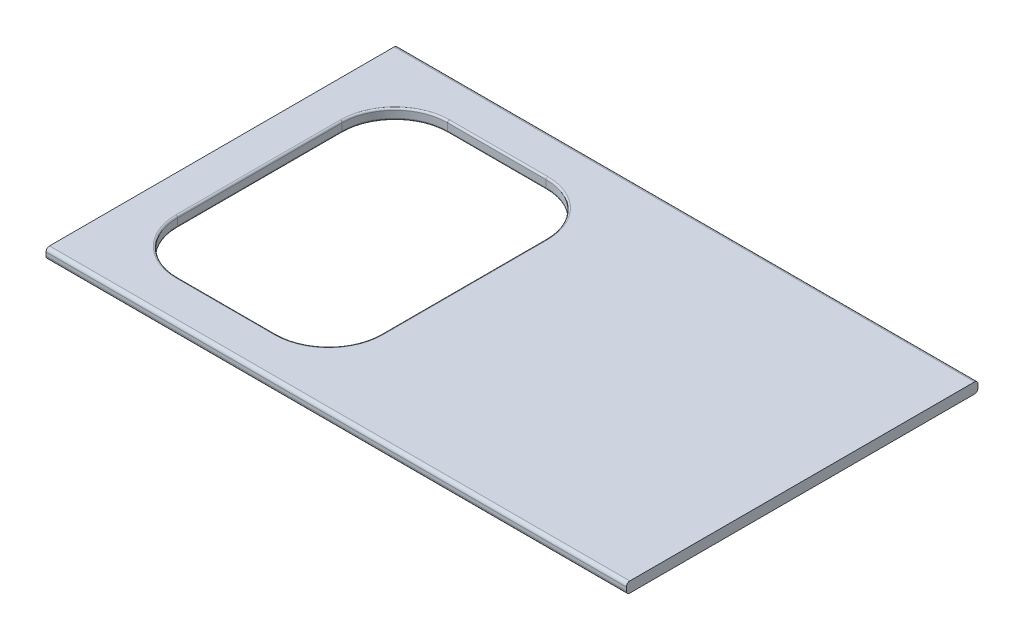
ISO-10303-21;
HEADER;
FILE_DESCRIPTION(('STEP AP214'),'2;1');
FILE_NAME('part.step','',(''),(''),'','','');
FILE_SCHEMA(('AUTOMOTIVE_DESIGN { 1 0 10303 214 1 1 1 1 }'));
ENDSEC;
DATA;
#1=APPLICATION_CONTEXT('core data for automotive mechanical design processes');
#2=APPLICATION_PROTOCOL_DEFINITION('international standard','automotive_design',2000,#1);
#3=PRODUCT_CONTEXT('',#1,'mechanical');
#4=PRODUCT('Part','Part','',(#3));
#5=PRODUCT_RELATED_PRODUCT_CATEGORY('part','',(#4));
#6=PRODUCT_DEFINITION_FORMATION('','',#4);
#7=PRODUCT_DEFINITION_CONTEXT('part definition',#1,'design');
#8=PRODUCT_DEFINITION('design','',#6,#7);
#9=PRODUCT_DEFINITION_SHAPE('','',#8);
#10=(LENGTH_UNIT() NAMED_UNIT(*) SI_UNIT(.MILLI.,.METRE.));
#11=(NAMED_UNIT(*) PLANE_ANGLE_UNIT() SI_UNIT($,.RADIAN.));
#12=(NAMED_UNIT(*) SI_UNIT($,.STERADIAN.) SOLID_ANGLE_UNIT());
#13=UNCERTAINTY_MEASURE_WITH_UNIT(LENGTH_MEASURE(1.E-05),#10,'distance_accuracy_value','');
#14=(GEOMETRIC_REPRESENTATION_CONTEXT(3) GLOBAL_UNCERTAINTY_ASSIGNED_CONTEXT((#13)) GLOBAL_UNIT_ASSIGNED_CONTEXT((#10,
#11,#12)) REPRESENTATION_CONTEXT('',''));
#15=CARTESIAN_POINT('',(0.,0.,0.));
#16=DIRECTION('',(0.,0.,1.));
#17=DIRECTION('',(1.,0.,0.));
#18=AXIS2_PLACEMENT_3D('',#15,#16,#17);
#19=CARTESIAN_POINT('',(82.5,3.,50.));
#20=DIRECTION('',(-1.,0.,0.));
#21=DIRECTION('',(0.,0.,1.));
#22=AXIS2_PLACEMENT_3D('',#19,#20,#21);
#23=PLANE('',#22);
#24=DIRECTION('',(0.,-1.,0.));
#25=VECTOR('',#24,1.);
#26=CARTESIAN_POINT('',(82.5,3.,-50.));
#27=LINE('',#26,#25);
#28=CARTESIAN_POINT('',(82.5,2.,-50.));
#29=VERTEX_POINT('',#28);
#30=CARTESIAN_POINT('',(82.5,1.,-50.));
#31=VERTEX_POINT('',#30);
#32=EDGE_CURVE('E249',#29,#31,#27,.T.);
#33=ORIENTED_EDGE('',*,*,#32,.F.);
#34=CARTESIAN_POINT('',(82.5,2.,-49.));
#35=DIRECTION('',(-1.,0.,0.));
#36=DIRECTION('',(0.,0.,1.));
#37=AXIS2_PLACEMENT_3D('',#34,#35,#36);
#38=CIRCLE('',#37,1.);
#39=CARTESIAN_POINT('',(82.5,3.,-49.));
#40=VERTEX_POINT('',#39);
#41=EDGE_CURVE('E230',#29,#40,#38,.F.);
#42=ORIENTED_EDGE('',*,*,#41,.T.);
#43=DIRECTION('',(0.,0.,-1.));
#44=VECTOR('',#43,1.);
#45=CARTESIAN_POINT('',(82.5,3.,50.));
#46=LINE('',#45,#44);
#47=CARTESIAN_POINT('',(82.5,3.,49.));
#48=VERTEX_POINT('',#47);
#49=EDGE_CURVE('E221',#48,#40,#46,.T.);
#50=ORIENTED_EDGE('',*,*,#49,.F.);
#51=CARTESIAN_POINT('',(82.5,2.,49.));
#52=DIRECTION('',(-1.,0.,0.));
#53=DIRECTION('',(0.,0.,1.));
#54=AXIS2_PLACEMENT_3D('',#51,#52,#53);
#55=CIRCLE('',#54,1.);
#56=CARTESIAN_POINT('',(82.5,2.,50.));
#57=VERTEX_POINT('',#56);
#58=EDGE_CURVE('E203',#48,#57,#55,.F.);
#59=ORIENTED_EDGE('',*,*,#58,.T.);
#60=DIRECTION('',(0.,-1.,0.));
#61=VECTOR('',#60,1.);
#62=CARTESIAN_POINT('',(82.5,3.,50.));
#63=LINE('',#62,#61);
#64=CARTESIAN_POINT('',(82.5,1.,50.));
#65=VERTEX_POINT('',#64);
#66=EDGE_CURVE('E233',#57,#65,#63,.T.);
#67=ORIENTED_EDGE('',*,*,#66,.T.);
#68=CARTESIAN_POINT('',(82.5,1.,49.));
#69=DIRECTION('',(-1.,0.,0.));
#70=DIRECTION('',(0.,0.,1.));
#71=AXIS2_PLACEMENT_3D('',#68,#69,#70);
#72=CIRCLE('',#71,1.);
#73=CARTESIAN_POINT('',(82.5,0.,49.));
#74=VERTEX_POINT('',#73);
#75=EDGE_CURVE('E214',#65,#74,#72,.F.);
#76=ORIENTED_EDGE('',*,*,#75,.T.);
#77=DIRECTION('',(0.,0.,-1.));
#78=VECTOR('',#77,1.);
#79=CARTESIAN_POINT('',(82.5,0.,50.));
#80=LINE('',#79,#78);
#81=CARTESIAN_POINT('',(82.5,0.,-49.));
#82=VERTEX_POINT('',#81);
#83=EDGE_CURVE('E236',#74,#82,#80,.T.);
#84=ORIENTED_EDGE('',*,*,#83,.T.);
#85=CARTESIAN_POINT('',(82.5,1.,-49.));
#86=DIRECTION('',(-1.,0.,0.));
#87=DIRECTION('',(0.,0.,1.));
#88=AXIS2_PLACEMENT_3D('',#85,#86,#87);
#89=CIRCLE('',#88,1.);
#90=EDGE_CURVE('E213',#82,#31,#89,.F.);
#91=ORIENTED_EDGE('',*,*,#90,.T.);
#92=EDGE_LOOP('',(#33,#42,#50,#59,#67,#76,#84,#91));
#93=FACE_BOUND('',#92,.T.);
#94=ADVANCED_FACE('F39',(#93),#23,.F.);
#95=CARTESIAN_POINT('',(-82.5,3.,-50.));
#96=DIRECTION('',(0.,0.,1.));
#97=DIRECTION('',(1.,0.,0.));
#98=AXIS2_PLACEMENT_3D('',#95,#96,#97);
#99=PLANE('',#98);
#100=DIRECTION('',(0.,-1.,0.));
#101=VECTOR('',#100,1.);
#102=CARTESIAN_POINT('',(-82.5,3.,-50.));
#103=LINE('',#102,#101);
#104=CARTESIAN_POINT('',(-82.5,2.,-50.));
#105=VERTEX_POINT('',#104);
#106=CARTESIAN_POINT('',(-82.5,1.,-50.));
#107=VERTEX_POINT('',#106);
#108=EDGE_CURVE('E246',#105,#107,#103,.T.);
#109=ORIENTED_EDGE('',*,*,#108,.F.);
#110=DIRECTION('',(-1.,0.,0.));
#111=VECTOR('',#110,1.);
#112=CARTESIAN_POINT('',(-82.5,2.,-50.));
#113=LINE('',#112,#111);
#114=EDGE_CURVE('E287',#105,#29,#113,.F.);
#115=ORIENTED_EDGE('',*,*,#114,.T.);
#116=ORIENTED_EDGE('',*,*,#32,.T.);
#117=DIRECTION('',(-1.,0.,0.));
#118=VECTOR('',#117,1.);
#119=CARTESIAN_POINT('',(-82.5,1.,-50.));
#120=LINE('',#119,#118);
#121=EDGE_CURVE('E284',#31,#107,#120,.T.);
#122=ORIENTED_EDGE('',*,*,#121,.T.);
#123=EDGE_LOOP('',(#109,#115,#116,#122));
#124=FACE_BOUND('',#123,.T.);
#125=ADVANCED_FACE('F509',(#124),#99,.F.);
#126=CARTESIAN_POINT('',(-82.5,3.,50.));
#127=DIRECTION('',(1.,0.,0.));
#128=DIRECTION('',(0.,0.,-1.));
#129=AXIS2_PLACEMENT_3D('',#126,#127,#128);
#130=PLANE('',#129);
#131=DIRECTION('',(0.,0.,1.));
#132=VECTOR('',#131,1.);
#133=CARTESIAN_POINT('',(-82.5,3.,50.));
#134=LINE('',#133,#132);
#135=CARTESIAN_POINT('',(-82.5,3.,-49.));
#136=VERTEX_POINT('',#135);
#137=CARTESIAN_POINT('',(-82.5,3.,49.));
#138=VERTEX_POINT('',#137);
#139=EDGE_CURVE('E224',#136,#138,#134,.T.);
#140=ORIENTED_EDGE('',*,*,#139,.F.);
#141=CARTESIAN_POINT('',(-82.5,2.,-49.));
#142=DIRECTION('',(1.,0.,0.));
#143=DIRECTION('',(0.,0.,-1.));
#144=AXIS2_PLACEMENT_3D('',#141,#142,#143);
#145=CIRCLE('',#144,1.);
#146=EDGE_CURVE('E282',#136,#105,#145,.F.);
#147=ORIENTED_EDGE('',*,*,#146,.T.);
#148=ORIENTED_EDGE('',*,*,#108,.T.);
#149=CARTESIAN_POINT('',(-82.5,1.,-49.));
#150=DIRECTION('',(1.,0.,0.));
#151=DIRECTION('',(0.,0.,-1.));
#152=AXIS2_PLACEMENT_3D('',#149,#150,#151);
#153=CIRCLE('',#152,1.);
#154=CARTESIAN_POINT('',(-82.5,0.,-49.));
#155=VERTEX_POINT('',#154);
#156=EDGE_CURVE('E280',#107,#155,#153,.F.);
#157=ORIENTED_EDGE('',*,*,#156,.T.);
#158=DIRECTION('',(0.,0.,1.));
#159=VECTOR('',#158,1.);
#160=CARTESIAN_POINT('',(-82.5,0.,50.));
#161=LINE('',#160,#159);
#162=CARTESIAN_POINT('',(-82.5,0.,49.));
#163=VERTEX_POINT('',#162);
#164=EDGE_CURVE('E231',#155,#163,#161,.T.);
#165=ORIENTED_EDGE('',*,*,#164,.T.);
#166=CARTESIAN_POINT('',(-82.5,1.,49.));
#167=DIRECTION('',(1.,0.,0.));
#168=DIRECTION('',(0.,0.,-1.));
#169=AXIS2_PLACEMENT_3D('',#166,#167,#168);
#170=CIRCLE('',#169,1.);
#171=CARTESIAN_POINT('',(-82.5,1.,50.));
#172=VERTEX_POINT('',#171);
#173=EDGE_CURVE('E276',#163,#172,#170,.F.);
#174=ORIENTED_EDGE('',*,*,#173,.T.);
#175=DIRECTION('',(0.,-1.,0.));
#176=VECTOR('',#175,1.);
#177=CARTESIAN_POINT('',(-82.5,3.,50.));
#178=LINE('',#177,#176);
#179=CARTESIAN_POINT('',(-82.5,2.,50.));
#180=VERTEX_POINT('',#179);
#181=EDGE_CURVE('E243',#180,#172,#178,.T.);
#182=ORIENTED_EDGE('',*,*,#181,.F.);
#183=CARTESIAN_POINT('',(-82.5,2.,49.));
#184=DIRECTION('',(1.,0.,0.));
#185=DIRECTION('',(0.,0.,-1.));
#186=AXIS2_PLACEMENT_3D('',#183,#184,#185);
#187=CIRCLE('',#186,1.);
#188=EDGE_CURVE('E278',#180,#138,#187,.F.);
#189=ORIENTED_EDGE('',*,*,#188,.T.);
#190=EDGE_LOOP('',(#140,#147,#148,#157,#165,#174,#182,#189));
#191=FACE_BOUND('',#190,.T.);
#192=ADVANCED_FACE('F514',(#191),#130,.F.);
#193=CARTESIAN_POINT('',(-82.5,3.,50.));
#194=DIRECTION('',(0.,0.,-1.));
#195=DIRECTION('',(-1.,0.,0.));
#196=AXIS2_PLACEMENT_3D('',#193,#194,#195);
#197=PLANE('',#196);
#198=ORIENTED_EDGE('',*,*,#66,.F.);
#199=DIRECTION('',(1.,0.,0.));
#200=VECTOR('',#199,1.);
#201=CARTESIAN_POINT('',(-82.5,2.,50.));
#202=LINE('',#201,#200);
#203=EDGE_CURVE('E208',#57,#180,#202,.F.);
#204=ORIENTED_EDGE('',*,*,#203,.T.);
#205=ORIENTED_EDGE('',*,*,#181,.T.);
#206=DIRECTION('',(1.,0.,0.));
#207=VECTOR('',#206,1.);
#208=CARTESIAN_POINT('',(82.5,1.,50.));
#209=LINE('',#208,#207);
#210=EDGE_CURVE('E296',#172,#65,#209,.T.);
#211=ORIENTED_EDGE('',*,*,#210,.T.);
#212=EDGE_LOOP('',(#198,#204,#205,#211));
#213=FACE_BOUND('',#212,.T.);
#214=ADVANCED_FACE('F790',(#213),#197,.F.);
#215=CARTESIAN_POINT('',(0.,3.,0.));
#216=DIRECTION('',(0.,-1.,0.));
#217=DIRECTION('',(0.,0.,-1.));
#218=AXIS2_PLACEMENT_3D('',#215,#216,#217);
#219=PLANE('',#218);
#220=DIRECTION('',(-1.,0.,0.));
#221=VECTOR('',#220,1.);
#222=CARTESIAN_POINT('',(0.,3.,38.9114531698444));
#223=LINE('',#222,#221);
#224=CARTESIAN_POINT('',(-28.7193506649499,3.,38.9114531698444));
#225=VERTEX_POINT('',#224);
#226=CARTESIAN_POINT('',(-56.6888221740228,3.,38.9114531698444));
#227=VERTEX_POINT('',#226);
#228=EDGE_CURVE('E312',#225,#227,#223,.T.);
#229=ORIENTED_EDGE('',*,*,#228,.T.);
#230=CARTESIAN_POINT('',(-56.6888221740228,3.,23.4114531698444));
#231=DIRECTION('',(0.,-1.,0.));
#232=DIRECTION('',(0.,0.,-1.));
#233=AXIS2_PLACEMENT_3D('',#230,#231,#232);
#234=CIRCLE('',#233,15.5);
#235=CARTESIAN_POINT('',(-72.1888221740228,3.,23.4114531698444));
#236=VERTEX_POINT('',#235);
#237=EDGE_CURVE('E314',#227,#236,#234,.T.);
#238=ORIENTED_EDGE('',*,*,#237,.T.);
#239=DIRECTION('',(0.,0.,-1.));
#240=VECTOR('',#239,1.);
#241=CARTESIAN_POINT('',(-72.1888221740228,3.,0.));
#242=LINE('',#241,#240);
#243=CARTESIAN_POINT('',(-72.1888221740228,3.,-23.4114531698444));
#244=VERTEX_POINT('',#243);
#245=EDGE_CURVE('E300',#236,#244,#242,.T.);
#246=ORIENTED_EDGE('',*,*,#245,.T.);
#247=CARTESIAN_POINT('',(-56.6888221740228,3.,-23.4114531698444));
#248=DIRECTION('',(0.,-1.,0.));
#249=DIRECTION('',(0.,0.,-1.));
#250=AXIS2_PLACEMENT_3D('',#247,#248,#249);
#251=CIRCLE('',#250,15.5);
#252=CARTESIAN_POINT('',(-56.6888221740228,3.,-38.9114531698444));
#253=VERTEX_POINT('',#252);
#254=EDGE_CURVE('E302',#244,#253,#251,.T.);
#255=ORIENTED_EDGE('',*,*,#254,.T.);
#256=DIRECTION('',(1.,0.,0.));
#257=VECTOR('',#256,1.);
#258=CARTESIAN_POINT('',(0.,3.,-38.9114531698444));
#259=LINE('',#258,#257);
#260=CARTESIAN_POINT('',(-28.7193506649499,3.,-38.9114531698444));
#261=VERTEX_POINT('',#260);
#262=EDGE_CURVE('E304',#253,#261,#259,.T.);
#263=ORIENTED_EDGE('',*,*,#262,.T.);
#264=CARTESIAN_POINT('',(-28.7193506649499,3.,-23.4114531698444));
#265=DIRECTION('',(0.,-1.,0.));
#266=DIRECTION('',(0.,0.,-1.));
#267=AXIS2_PLACEMENT_3D('',#264,#265,#266);
#268=CIRCLE('',#267,15.5);
#269=CARTESIAN_POINT('',(-13.2193506649499,3.,-23.4114531698444));
#270=VERTEX_POINT('',#269);
#271=EDGE_CURVE('E306',#261,#270,#268,.T.);
#272=ORIENTED_EDGE('',*,*,#271,.T.);
#273=DIRECTION('',(0.,0.,1.));
#274=VECTOR('',#273,1.);
#275=CARTESIAN_POINT('',(-13.2193506649499,3.,0.));
#276=LINE('',#275,#274);
#277=CARTESIAN_POINT('',(-13.2193506649499,3.,23.4114531698444));
#278=VERTEX_POINT('',#277);
#279=EDGE_CURVE('E308',#270,#278,#276,.T.);
#280=ORIENTED_EDGE('',*,*,#279,.T.);
#281=CARTESIAN_POINT('',(-28.7193506649499,3.,23.4114531698444));
#282=DIRECTION('',(0.,-1.,0.));
#283=DIRECTION('',(0.,0.,-1.));
#284=AXIS2_PLACEMENT_3D('',#281,#282,#283);
#285=CIRCLE('',#284,15.5);
#286=EDGE_CURVE('E310',#278,#225,#285,.T.);
#287=ORIENTED_EDGE('',*,*,#286,.T.);
#288=EDGE_LOOP('',(#229,#238,#246,#255,#263,#272,#280,#287));
#289=FACE_BOUND('',#288,.T.);
#290=ORIENTED_EDGE('',*,*,#49,.T.);
#291=DIRECTION('',(-1.,0.,0.));
#292=VECTOR('',#291,1.);
#293=CARTESIAN_POINT('',(0.,3.,-49.));
#294=LINE('',#293,#292);
#295=EDGE_CURVE('E225',#40,#136,#294,.T.);
#296=ORIENTED_EDGE('',*,*,#295,.T.);
#297=ORIENTED_EDGE('',*,*,#139,.T.);
#298=DIRECTION('',(1.,0.,0.));
#299=VECTOR('',#298,1.);
#300=CARTESIAN_POINT('',(0.,3.,49.));
#301=LINE('',#300,#299);
#302=EDGE_CURVE('E207',#138,#48,#301,.T.);
#303=ORIENTED_EDGE('',*,*,#302,.T.);
#304=EDGE_LOOP('',(#290,#296,#297,#303));
#305=FACE_BOUND('',#304,.T.);
#306=ADVANCED_FACE('F219',(#289,#305),#219,.F.);
#307=CARTESIAN_POINT('',(0.,0.,0.));
#308=DIRECTION('',(0.,-1.,0.));
#309=DIRECTION('',(0.,0.,-1.));
#310=AXIS2_PLACEMENT_3D('',#307,#308,#309);
#311=PLANE('',#310);
#312=DIRECTION('',(0.,0.,-1.));
#313=VECTOR('',#312,1.);
#314=CARTESIAN_POINT('',(-72.1888221740228,0.,23.4114531698445));
#315=LINE('',#314,#313);
#316=CARTESIAN_POINT('',(-72.1888221740228,0.,-23.4114531698444));
#317=VERTEX_POINT('',#316);
#318=CARTESIAN_POINT('',(-72.1888221740228,0.,23.4114531698444));
#319=VERTEX_POINT('',#318);
#320=EDGE_CURVE('E347',#317,#319,#315,.F.);
#321=ORIENTED_EDGE('',*,*,#320,.T.);
#322=CARTESIAN_POINT('',(-56.6888221740228,0.,23.4114531698444));
#323=DIRECTION('',(0.,-1.,0.));
#324=DIRECTION('',(0.,0.,-1.));
#325=AXIS2_PLACEMENT_3D('',#322,#323,#324);
#326=CIRCLE('',#325,15.5);
#327=CARTESIAN_POINT('',(-56.6888221740228,0.,38.9114531698444));
#328=VERTEX_POINT('',#327);
#329=EDGE_CURVE('E360',#319,#328,#326,.F.);
#330=ORIENTED_EDGE('',*,*,#329,.T.);
#331=DIRECTION('',(-1.,0.,0.));
#332=VECTOR('',#331,1.);
#333=CARTESIAN_POINT('',(-28.7193506649499,0.,38.9114531698444));
#334=LINE('',#333,#332);
#335=CARTESIAN_POINT('',(-28.7193506649499,0.,38.9114531698444));
#336=VERTEX_POINT('',#335);
#337=EDGE_CURVE('E63',#328,#336,#334,.F.);
#338=ORIENTED_EDGE('',*,*,#337,.T.);
#339=CARTESIAN_POINT('',(-28.7193506649499,0.,23.4114531698444));
#340=DIRECTION('',(0.,-1.,0.));
#341=DIRECTION('',(0.,0.,-1.));
#342=AXIS2_PLACEMENT_3D('',#339,#340,#341);
#343=CIRCLE('',#342,15.5);
#344=CARTESIAN_POINT('',(-13.2193506649499,0.,23.4114531698444));
#345=VERTEX_POINT('',#344);
#346=EDGE_CURVE('E357',#336,#345,#343,.F.);
#347=ORIENTED_EDGE('',*,*,#346,.T.);
#348=DIRECTION('',(0.,0.,1.));
#349=VECTOR('',#348,1.);
#350=CARTESIAN_POINT('',(-13.2193506649499,0.,-23.4114531698444));
#351=LINE('',#350,#349);
#352=CARTESIAN_POINT('',(-13.2193506649499,0.,-23.4114531698444));
#353=VERTEX_POINT('',#352);
#354=EDGE_CURVE('E355',#345,#353,#351,.F.);
#355=ORIENTED_EDGE('',*,*,#354,.T.);
#356=CARTESIAN_POINT('',(-28.7193506649499,0.,-23.4114531698444));
#357=DIRECTION('',(0.,-1.,0.));
#358=DIRECTION('',(0.,0.,-1.));
#359=AXIS2_PLACEMENT_3D('',#356,#357,#358);
#360=CIRCLE('',#359,15.5);
#361=CARTESIAN_POINT('',(-28.7193506649499,0.,-38.9114531698444));
#362=VERTEX_POINT('',#361);
#363=EDGE_CURVE('E353',#353,#362,#360,.F.);
#364=ORIENTED_EDGE('',*,*,#363,.T.);
#365=DIRECTION('',(1.,0.,0.));
#366=VECTOR('',#365,1.);
#367=CARTESIAN_POINT('',(-56.6888221740228,0.,-38.9114531698444));
#368=LINE('',#367,#366);
#369=CARTESIAN_POINT('',(-56.6888221740228,0.,-38.9114531698444));
#370=VERTEX_POINT('',#369);
#371=EDGE_CURVE('E351',#362,#370,#368,.F.);
#372=ORIENTED_EDGE('',*,*,#371,.T.);
#373=CARTESIAN_POINT('',(-56.6888221740228,0.,-23.4114531698444));
#374=DIRECTION('',(0.,-1.,0.));
#375=DIRECTION('',(0.,0.,-1.));
#376=AXIS2_PLACEMENT_3D('',#373,#374,#375);
#377=CIRCLE('',#376,15.5);
#378=EDGE_CURVE('E349',#370,#317,#377,.F.);
#379=ORIENTED_EDGE('',*,*,#378,.T.);
#380=EDGE_LOOP('',(#321,#330,#338,#347,#355,#364,#372,#379));
#381=FACE_BOUND('',#380,.T.);
#382=ORIENTED_EDGE('',*,*,#164,.F.);
#383=DIRECTION('',(-1.,0.,0.));
#384=VECTOR('',#383,1.);
#385=CARTESIAN_POINT('',(82.5,0.,-49.));
#386=LINE('',#385,#384);
#387=EDGE_CURVE('E294',#155,#82,#386,.F.);
#388=ORIENTED_EDGE('',*,*,#387,.T.);
#389=ORIENTED_EDGE('',*,*,#83,.F.);
#390=DIRECTION('',(1.,0.,0.));
#391=VECTOR('',#390,1.);
#392=CARTESIAN_POINT('',(-82.5,0.,49.));
#393=LINE('',#392,#391);
#394=EDGE_CURVE('E292',#74,#163,#393,.F.);
#395=ORIENTED_EDGE('',*,*,#394,.T.);
#396=EDGE_LOOP('',(#382,#388,#389,#395));
#397=FACE_BOUND('',#396,.T.);
#398=ADVANCED_FACE('F498',(#381,#397),#311,.T.);
#399=CARTESIAN_POINT('',(-13.7193506649499,3.,38.4114531698444));
#400=DIRECTION('',(1.,0.,0.));
#401=DIRECTION('',(0.,0.,-1.));
#402=AXIS2_PLACEMENT_3D('',#399,#400,#401);
#403=PLANE('',#402);
#404=DIRECTION('',(0.,-1.,0.));
#405=VECTOR('',#404,1.);
#406=CARTESIAN_POINT('',(-13.7193506649499,3.,23.4114531698444));
#407=LINE('',#406,#405);
#408=CARTESIAN_POINT('',(-13.7193506649499,0.5,23.4114531698444));
#409=VERTEX_POINT('',#408);
#410=CARTESIAN_POINT('',(-13.7193506649499,2.5,23.4114531698444));
#411=VERTEX_POINT('',#410);
#412=EDGE_CURVE('E270',#409,#411,#407,.F.);
#413=ORIENTED_EDGE('',*,*,#412,.T.);
#414=DIRECTION('',(0.,0.,1.));
#415=VECTOR('',#414,1.);
#416=CARTESIAN_POINT('',(-13.7193506649499,2.5,38.4114531698444));
#417=LINE('',#416,#415);
#418=CARTESIAN_POINT('',(-13.7193506649499,2.5,-23.4114531698444));
#419=VERTEX_POINT('',#418);
#420=EDGE_CURVE('E333',#411,#419,#417,.F.);
#421=ORIENTED_EDGE('',*,*,#420,.T.);
#422=DIRECTION('',(0.,-1.,0.));
#423=VECTOR('',#422,1.);
#424=CARTESIAN_POINT('',(-13.7193506649499,0.,-23.4114531698444));
#425=LINE('',#424,#423);
#426=CARTESIAN_POINT('',(-13.7193506649499,0.5,-23.4114531698444));
#427=VERTEX_POINT('',#426);
#428=EDGE_CURVE('E226',#419,#427,#425,.T.);
#429=ORIENTED_EDGE('',*,*,#428,.T.);
#430=DIRECTION('',(0.,0.,1.));
#431=VECTOR('',#430,1.);
#432=CARTESIAN_POINT('',(-13.7193506649499,0.5,23.4114531698445));
#433=LINE('',#432,#431);
#434=EDGE_CURVE('E331',#427,#409,#433,.T.);
#435=ORIENTED_EDGE('',*,*,#434,.T.);
#436=EDGE_LOOP('',(#413,#421,#429,#435));
#437=FACE_BOUND('',#436,.T.);
#438=ADVANCED_FACE('F420',(#437),#403,.F.);
#439=CARTESIAN_POINT('',(-71.6888221740228,3.,-38.4114531698444));
#440=DIRECTION('',(0.,0.,-1.));
#441=DIRECTION('',(-1.,0.,0.));
#442=AXIS2_PLACEMENT_3D('',#439,#440,#441);
#443=PLANE('',#442);
#444=DIRECTION('',(0.,-1.,0.));
#445=VECTOR('',#444,1.);
#446=CARTESIAN_POINT('',(-28.7193506649499,3.,-38.4114531698444));
#447=LINE('',#446,#445);
#448=CARTESIAN_POINT('',(-28.7193506649499,0.5,-38.4114531698444));
#449=VERTEX_POINT('',#448);
#450=CARTESIAN_POINT('',(-28.7193506649499,2.5,-38.4114531698444));
#451=VERTEX_POINT('',#450);
#452=EDGE_CURVE('E252',#449,#451,#447,.F.);
#453=ORIENTED_EDGE('',*,*,#452,.T.);
#454=DIRECTION('',(1.,0.,0.));
#455=VECTOR('',#454,1.);
#456=CARTESIAN_POINT('',(-71.6888221740228,2.5,-38.4114531698444));
#457=LINE('',#456,#455);
#458=CARTESIAN_POINT('',(-56.6888221740228,2.5,-38.4114531698444));
#459=VERTEX_POINT('',#458);
#460=EDGE_CURVE('E341',#451,#459,#457,.F.);
#461=ORIENTED_EDGE('',*,*,#460,.T.);
#462=DIRECTION('',(0.,-1.,0.));
#463=VECTOR('',#462,1.);
#464=CARTESIAN_POINT('',(-56.6888221740228,0.,-38.4114531698444));
#465=LINE('',#464,#463);
#466=CARTESIAN_POINT('',(-56.6888221740228,0.5,-38.4114531698444));
#467=VERTEX_POINT('',#466);
#468=EDGE_CURVE('E255',#459,#467,#465,.T.);
#469=ORIENTED_EDGE('',*,*,#468,.T.);
#470=DIRECTION('',(1.,0.,0.));
#471=VECTOR('',#470,1.);
#472=CARTESIAN_POINT('',(-28.7193506649499,0.5,-38.4114531698444));
#473=LINE('',#472,#471);
#474=EDGE_CURVE('E339',#467,#449,#473,.T.);
#475=ORIENTED_EDGE('',*,*,#474,.T.);
#476=EDGE_LOOP('',(#453,#461,#469,#475));
#477=FACE_BOUND('',#476,.T.);
#478=ADVANCED_FACE('F443',(#477),#443,.F.);
#479=CARTESIAN_POINT('',(-71.6888221740228,3.,38.4114531698444));
#480=DIRECTION('',(-1.,0.,0.));
#481=DIRECTION('',(0.,0.,1.));
#482=AXIS2_PLACEMENT_3D('',#479,#480,#481);
#483=PLANE('',#482);
#484=DIRECTION('',(0.,-1.,0.));
#485=VECTOR('',#484,1.);
#486=CARTESIAN_POINT('',(-71.6888221740228,3.,-23.4114531698444));
#487=LINE('',#486,#485);
#488=CARTESIAN_POINT('',(-71.6888221740228,0.5,-23.4114531698444));
#489=VERTEX_POINT('',#488);
#490=CARTESIAN_POINT('',(-71.6888221740228,2.5,-23.4114531698444));
#491=VERTEX_POINT('',#490);
#492=EDGE_CURVE('E261',#489,#491,#487,.F.);
#493=ORIENTED_EDGE('',*,*,#492,.T.);
#494=DIRECTION('',(0.,0.,-1.));
#495=VECTOR('',#494,1.);
#496=CARTESIAN_POINT('',(-71.6888221740228,2.5,38.4114531698444));
#497=LINE('',#496,#495);
#498=CARTESIAN_POINT('',(-71.6888221740228,2.5,23.4114531698444));
#499=VERTEX_POINT('',#498);
#500=EDGE_CURVE('E11',#491,#499,#497,.F.);
#501=ORIENTED_EDGE('',*,*,#500,.T.);
#502=DIRECTION('',(0.,-1.,0.));
#503=VECTOR('',#502,1.);
#504=CARTESIAN_POINT('',(-71.6888221740228,0.,23.4114531698444));
#505=LINE('',#504,#503);
#506=CARTESIAN_POINT('',(-71.6888221740228,0.5,23.4114531698444));
#507=VERTEX_POINT('',#506);
#508=EDGE_CURVE('E258',#499,#507,#505,.T.);
#509=ORIENTED_EDGE('',*,*,#508,.T.);
#510=DIRECTION('',(0.,0.,-1.));
#511=VECTOR('',#510,1.);
#512=CARTESIAN_POINT('',(-71.6888221740228,0.5,-23.4114531698444));
#513=LINE('',#512,#511);
#514=EDGE_CURVE('E48',#507,#489,#513,.T.);
#515=ORIENTED_EDGE('',*,*,#514,.T.);
#516=EDGE_LOOP('',(#493,#501,#509,#515));
#517=FACE_BOUND('',#516,.T.);
#518=ADVANCED_FACE('F464',(#517),#483,.F.);
#519=CARTESIAN_POINT('',(-71.6888221740228,3.,38.4114531698444));
#520=DIRECTION('',(0.,0.,1.));
#521=DIRECTION('',(1.,0.,0.));
#522=AXIS2_PLACEMENT_3D('',#519,#520,#521);
#523=PLANE('',#522);
#524=DIRECTION('',(0.,-1.,0.));
#525=VECTOR('',#524,1.);
#526=CARTESIAN_POINT('',(-56.6888221740228,3.,38.4114531698444));
#527=LINE('',#526,#525);
#528=CARTESIAN_POINT('',(-56.6888221740228,0.5,38.4114531698444));
#529=VERTEX_POINT('',#528);
#530=CARTESIAN_POINT('',(-56.6888221740228,2.5,38.4114531698444));
#531=VERTEX_POINT('',#530);
#532=EDGE_CURVE('E267',#529,#531,#527,.F.);
#533=ORIENTED_EDGE('',*,*,#532,.T.);
#534=DIRECTION('',(-1.,0.,0.));
#535=VECTOR('',#534,1.);
#536=CARTESIAN_POINT('',(-71.6888221740228,2.5,38.4114531698444));
#537=LINE('',#536,#535);
#538=CARTESIAN_POINT('',(-28.7193506649499,2.5,38.4114531698444));
#539=VERTEX_POINT('',#538);
#540=EDGE_CURVE('E325',#531,#539,#537,.F.);
#541=ORIENTED_EDGE('',*,*,#540,.T.);
#542=DIRECTION('',(0.,-1.,0.));
#543=VECTOR('',#542,1.);
#544=CARTESIAN_POINT('',(-28.7193506649499,0.,38.4114531698444));
#545=LINE('',#544,#543);
#546=CARTESIAN_POINT('',(-28.7193506649499,0.5,38.4114531698444));
#547=VERTEX_POINT('',#546);
#548=EDGE_CURVE('E264',#539,#547,#545,.T.);
#549=ORIENTED_EDGE('',*,*,#548,.T.);
#550=DIRECTION('',(-1.,0.,0.));
#551=VECTOR('',#550,1.);
#552=CARTESIAN_POINT('',(-56.6888221740228,0.5,38.4114531698444));
#553=LINE('',#552,#551);
#554=EDGE_CURVE('E323',#547,#529,#553,.T.);
#555=ORIENTED_EDGE('',*,*,#554,.T.);
#556=EDGE_LOOP('',(#533,#541,#549,#555));
#557=FACE_BOUND('',#556,.T.);
#558=ADVANCED_FACE('F477',(#557),#523,.F.);
#559=CARTESIAN_POINT('',(-56.6888221740228,3.,-23.4114531698444));
#560=DIRECTION('',(0.,1.,0.));
#561=DIRECTION('',(0.,0.,1.));
#562=AXIS2_PLACEMENT_3D('',#559,#560,#561);
#563=CYLINDRICAL_SURFACE('',#562,15.);
#564=ORIENTED_EDGE('',*,*,#468,.F.);
#565=CARTESIAN_POINT('',(-56.6888221740228,2.5,-23.4114531698444));
#566=DIRECTION('',(0.,-1.,0.));
#567=DIRECTION('',(0.,0.,-1.));
#568=AXIS2_PLACEMENT_3D('',#565,#566,#567);
#569=CIRCLE('',#568,15.);
#570=EDGE_CURVE('E345',#459,#491,#569,.F.);
#571=ORIENTED_EDGE('',*,*,#570,.T.);
#572=ORIENTED_EDGE('',*,*,#492,.F.);
#573=CARTESIAN_POINT('',(-56.6888221740228,0.5,-23.4114531698444));
#574=DIRECTION('',(0.,-1.,0.));
#575=DIRECTION('',(0.,0.,-1.));
#576=AXIS2_PLACEMENT_3D('',#573,#574,#575);
#577=CIRCLE('',#576,15.);
#578=EDGE_CURVE('E343',#489,#467,#577,.T.);
#579=ORIENTED_EDGE('',*,*,#578,.T.);
#580=EDGE_LOOP('',(#564,#571,#572,#579));
#581=FACE_BOUND('',#580,.T.);
#582=ADVANCED_FACE('F447',(#581),#563,.F.);
#583=CARTESIAN_POINT('',(-56.6888221740228,3.,23.4114531698444));
#584=DIRECTION('',(0.,1.,0.));
#585=DIRECTION('',(0.,0.,1.));
#586=AXIS2_PLACEMENT_3D('',#583,#584,#585);
#587=CYLINDRICAL_SURFACE('',#586,15.);
#588=ORIENTED_EDGE('',*,*,#508,.F.);
#589=CARTESIAN_POINT('',(-56.6888221740228,2.5,23.4114531698444));
#590=DIRECTION('',(0.,-1.,0.));
#591=DIRECTION('',(0.,0.,-1.));
#592=AXIS2_PLACEMENT_3D('',#589,#590,#591);
#593=CIRCLE('',#592,15.);
#594=EDGE_CURVE('E320',#499,#531,#593,.F.);
#595=ORIENTED_EDGE('',*,*,#594,.T.);
#596=ORIENTED_EDGE('',*,*,#532,.F.);
#597=CARTESIAN_POINT('',(-56.6888221740228,0.5,23.4114531698444));
#598=DIRECTION('',(0.,-1.,0.));
#599=DIRECTION('',(0.,0.,-1.));
#600=AXIS2_PLACEMENT_3D('',#597,#598,#599);
#601=CIRCLE('',#600,15.);
#602=EDGE_CURVE('E317',#529,#507,#601,.T.);
#603=ORIENTED_EDGE('',*,*,#602,.T.);
#604=EDGE_LOOP('',(#588,#595,#596,#603));
#605=FACE_BOUND('',#604,.T.);
#606=ADVANCED_FACE('F467',(#605),#587,.F.);
#607=CARTESIAN_POINT('',(-28.7193506649499,3.,-23.4114531698444));
#608=DIRECTION('',(0.,1.,0.));
#609=DIRECTION('',(0.,0.,1.));
#610=AXIS2_PLACEMENT_3D('',#607,#608,#609);
#611=CYLINDRICAL_SURFACE('',#610,15.);
#612=ORIENTED_EDGE('',*,*,#428,.F.);
#613=CARTESIAN_POINT('',(-28.7193506649499,2.5,-23.4114531698444));
#614=DIRECTION('',(0.,-1.,0.));
#615=DIRECTION('',(0.,0.,-1.));
#616=AXIS2_PLACEMENT_3D('',#613,#614,#615);
#617=CIRCLE('',#616,15.);
#618=EDGE_CURVE('E337',#419,#451,#617,.F.);
#619=ORIENTED_EDGE('',*,*,#618,.T.);
#620=ORIENTED_EDGE('',*,*,#452,.F.);
#621=CARTESIAN_POINT('',(-28.7193506649499,0.5,-23.4114531698444));
#622=DIRECTION('',(0.,-1.,0.));
#623=DIRECTION('',(0.,0.,-1.));
#624=AXIS2_PLACEMENT_3D('',#621,#622,#623);
#625=CIRCLE('',#624,15.);
#626=EDGE_CURVE('E335',#449,#427,#625,.T.);
#627=ORIENTED_EDGE('',*,*,#626,.T.);
#628=EDGE_LOOP('',(#612,#619,#620,#627));
#629=FACE_BOUND('',#628,.T.);
#630=ADVANCED_FACE('F417',(#629),#611,.F.);
#631=CARTESIAN_POINT('',(-28.7193506649499,3.,23.4114531698444));
#632=DIRECTION('',(0.,1.,0.));
#633=DIRECTION('',(0.,0.,1.));
#634=AXIS2_PLACEMENT_3D('',#631,#632,#633);
#635=CYLINDRICAL_SURFACE('',#634,15.);
#636=ORIENTED_EDGE('',*,*,#548,.F.);
#637=CARTESIAN_POINT('',(-28.7193506649499,2.5,23.4114531698444));
#638=DIRECTION('',(0.,-1.,0.));
#639=DIRECTION('',(0.,0.,-1.));
#640=AXIS2_PLACEMENT_3D('',#637,#638,#639);
#641=CIRCLE('',#640,15.);
#642=EDGE_CURVE('E329',#539,#411,#641,.F.);
#643=ORIENTED_EDGE('',*,*,#642,.T.);
#644=ORIENTED_EDGE('',*,*,#412,.F.);
#645=CARTESIAN_POINT('',(-28.7193506649499,0.5,23.4114531698444));
#646=DIRECTION('',(0.,-1.,0.));
#647=DIRECTION('',(0.,0.,-1.));
#648=AXIS2_PLACEMENT_3D('',#645,#646,#647);
#649=CIRCLE('',#648,15.);
#650=EDGE_CURVE('E327',#409,#547,#649,.T.);
#651=ORIENTED_EDGE('',*,*,#650,.T.);
#652=EDGE_LOOP('',(#636,#643,#644,#651));
#653=FACE_BOUND('',#652,.T.);
#654=ADVANCED_FACE('F480',(#653),#635,.F.);
#655=CARTESIAN_POINT('',(0.,2.,-49.));
#656=DIRECTION('',(-1.,0.,0.));
#657=DIRECTION('',(0.,0.,1.));
#658=AXIS2_PLACEMENT_3D('',#655,#656,#657);
#659=CYLINDRICAL_SURFACE('',#658,1.);
#660=ORIENTED_EDGE('',*,*,#41,.F.);
#661=ORIENTED_EDGE('',*,*,#114,.F.);
#662=ORIENTED_EDGE('',*,*,#146,.F.);
#663=ORIENTED_EDGE('',*,*,#295,.F.);
#664=EDGE_LOOP('',(#660,#661,#662,#663));
#665=FACE_BOUND('',#664,.T.);
#666=ADVANCED_FACE('F527',(#665),#659,.T.);
#667=CARTESIAN_POINT('',(-82.5,1.,-49.));
#668=DIRECTION('',(1.,0.,0.));
#669=DIRECTION('',(0.,0.,-1.));
#670=AXIS2_PLACEMENT_3D('',#667,#668,#669);
#671=CYLINDRICAL_SURFACE('',#670,1.);
#672=ORIENTED_EDGE('',*,*,#90,.F.);
#673=ORIENTED_EDGE('',*,*,#387,.F.);
#674=ORIENTED_EDGE('',*,*,#156,.F.);
#675=ORIENTED_EDGE('',*,*,#121,.F.);
#676=EDGE_LOOP('',(#672,#673,#674,#675));
#677=FACE_BOUND('',#676,.T.);
#678=ADVANCED_FACE('F530',(#677),#671,.T.);
#679=CARTESIAN_POINT('',(0.,2.,49.));
#680=DIRECTION('',(1.,0.,0.));
#681=DIRECTION('',(0.,0.,-1.));
#682=AXIS2_PLACEMENT_3D('',#679,#680,#681);
#683=CYLINDRICAL_SURFACE('',#682,1.);
#684=ORIENTED_EDGE('',*,*,#188,.F.);
#685=ORIENTED_EDGE('',*,*,#203,.F.);
#686=ORIENTED_EDGE('',*,*,#58,.F.);
#687=ORIENTED_EDGE('',*,*,#302,.F.);
#688=EDGE_LOOP('',(#684,#685,#686,#687));
#689=FACE_BOUND('',#688,.T.);
#690=ADVANCED_FACE('F206',(#689),#683,.T.);
#691=CARTESIAN_POINT('',(-82.5,1.,49.));
#692=DIRECTION('',(-1.,0.,0.));
#693=DIRECTION('',(0.,0.,1.));
#694=AXIS2_PLACEMENT_3D('',#691,#692,#693);
#695=CYLINDRICAL_SURFACE('',#694,1.);
#696=ORIENTED_EDGE('',*,*,#173,.F.);
#697=ORIENTED_EDGE('',*,*,#394,.F.);
#698=ORIENTED_EDGE('',*,*,#75,.F.);
#699=ORIENTED_EDGE('',*,*,#210,.F.);
#700=EDGE_LOOP('',(#696,#697,#698,#699));
#701=FACE_BOUND('',#700,.T.);
#702=ADVANCED_FACE('F537',(#701),#695,.T.);
#703=CARTESIAN_POINT('',(-28.7193506649499,2.5,-23.4114531698444));
#704=DIRECTION('',(0.,-1.,0.));
#705=DIRECTION('',(0.,0.,-1.));
#706=AXIS2_PLACEMENT_3D('',#703,#704,#705);
#707=TOROIDAL_SURFACE('',#706,15.5,0.5);
#708=CARTESIAN_POINT('',(-28.7193506649499,2.5,-38.9114531698444));
#709=DIRECTION('',(-1.,0.,0.));
#710=DIRECTION('',(0.,0.,1.));
#711=AXIS2_PLACEMENT_3D('',#708,#709,#710);
#712=CIRCLE('',#711,0.5);
#713=EDGE_CURVE('E379',#451,#261,#712,.T.);
#714=ORIENTED_EDGE('',*,*,#713,.F.);
#715=ORIENTED_EDGE('',*,*,#618,.F.);
#716=CARTESIAN_POINT('',(-13.2193506649499,2.5,-23.4114531698444));
#717=DIRECTION('',(0.,0.,1.));
#718=DIRECTION('',(1.,0.,0.));
#719=AXIS2_PLACEMENT_3D('',#716,#717,#718);
#720=CIRCLE('',#719,0.5);
#721=EDGE_CURVE('E240',#270,#419,#720,.T.);
#722=ORIENTED_EDGE('',*,*,#721,.F.);
#723=ORIENTED_EDGE('',*,*,#271,.F.);
#724=EDGE_LOOP('',(#714,#715,#722,#723));
#725=FACE_BOUND('',#724,.T.);
#726=ADVANCED_FACE('F440',(#725),#707,.T.);
#727=CARTESIAN_POINT('',(-13.2193506649499,2.5,0.));
#728=DIRECTION('',(0.,0.,1.));
#729=DIRECTION('',(1.,0.,0.));
#730=AXIS2_PLACEMENT_3D('',#727,#728,#729);
#731=CYLINDRICAL_SURFACE('',#730,0.5);
#732=ORIENTED_EDGE('',*,*,#721,.T.);
#733=ORIENTED_EDGE('',*,*,#420,.F.);
#734=CARTESIAN_POINT('',(-13.2193506649499,2.5,23.4114531698444));
#735=DIRECTION('',(0.,0.,1.));
#736=DIRECTION('',(1.,0.,0.));
#737=AXIS2_PLACEMENT_3D('',#734,#735,#736);
#738=CIRCLE('',#737,0.5);
#739=EDGE_CURVE('E376',#278,#411,#738,.T.);
#740=ORIENTED_EDGE('',*,*,#739,.F.);
#741=ORIENTED_EDGE('',*,*,#279,.F.);
#742=EDGE_LOOP('',(#732,#733,#740,#741));
#743=FACE_BOUND('',#742,.T.);
#744=ADVANCED_FACE('F425',(#743),#731,.T.);
#745=CARTESIAN_POINT('',(0.,2.5,-38.9114531698444));
#746=DIRECTION('',(1.,0.,0.));
#747=DIRECTION('',(0.,0.,-1.));
#748=AXIS2_PLACEMENT_3D('',#745,#746,#747);
#749=CYLINDRICAL_SURFACE('',#748,0.5);
#750=ORIENTED_EDGE('',*,*,#713,.T.);
#751=ORIENTED_EDGE('',*,*,#262,.F.);
#752=CARTESIAN_POINT('',(-56.6888221740228,2.5,-38.9114531698444));
#753=DIRECTION('',(-1.,0.,0.));
#754=DIRECTION('',(0.,0.,1.));
#755=AXIS2_PLACEMENT_3D('',#752,#753,#754);
#756=CIRCLE('',#755,0.5);
#757=EDGE_CURVE('E373',#459,#253,#756,.T.);
#758=ORIENTED_EDGE('',*,*,#757,.F.);
#759=ORIENTED_EDGE('',*,*,#460,.F.);
#760=EDGE_LOOP('',(#750,#751,#758,#759));
#761=FACE_BOUND('',#760,.T.);
#762=ADVANCED_FACE('F452',(#761),#749,.T.);
#763=CARTESIAN_POINT('',(-28.7193506649499,2.5,23.4114531698444));
#764=DIRECTION('',(0.,-1.,0.));
#765=DIRECTION('',(0.,0.,-1.));
#766=AXIS2_PLACEMENT_3D('',#763,#764,#765);
#767=TOROIDAL_SURFACE('',#766,15.5,0.5);
#768=ORIENTED_EDGE('',*,*,#739,.T.);
#769=ORIENTED_EDGE('',*,*,#642,.F.);
#770=CARTESIAN_POINT('',(-28.7193506649499,2.5,38.9114531698444));
#771=DIRECTION('',(-1.,0.,0.));
#772=DIRECTION('',(0.,0.,1.));
#773=AXIS2_PLACEMENT_3D('',#770,#771,#772);
#774=CIRCLE('',#773,0.5);
#775=EDGE_CURVE('E370',#225,#539,#774,.T.);
#776=ORIENTED_EDGE('',*,*,#775,.F.);
#777=ORIENTED_EDGE('',*,*,#286,.F.);
#778=EDGE_LOOP('',(#768,#769,#776,#777));
#779=FACE_BOUND('',#778,.T.);
#780=ADVANCED_FACE('F431',(#779),#767,.T.);
#781=CARTESIAN_POINT('',(-56.6888221740228,2.5,-23.4114531698444));
#782=DIRECTION('',(0.,-1.,0.));
#783=DIRECTION('',(0.,0.,-1.));
#784=AXIS2_PLACEMENT_3D('',#781,#782,#783);
#785=TOROIDAL_SURFACE('',#784,15.5,0.5);
#786=ORIENTED_EDGE('',*,*,#757,.T.);
#787=ORIENTED_EDGE('',*,*,#254,.F.);
#788=CARTESIAN_POINT('',(-72.1888221740228,2.5,-23.4114531698444));
#789=DIRECTION('',(0.,0.,1.));
#790=DIRECTION('',(1.,0.,0.));
#791=AXIS2_PLACEMENT_3D('',#788,#789,#790);
#792=CIRCLE('',#791,0.5);
#793=EDGE_CURVE('E367',#491,#244,#792,.T.);
#794=ORIENTED_EDGE('',*,*,#793,.F.);
#795=ORIENTED_EDGE('',*,*,#570,.F.);
#796=EDGE_LOOP('',(#786,#787,#794,#795));
#797=FACE_BOUND('',#796,.T.);
#798=ADVANCED_FACE('F456',(#797),#785,.T.);
#799=CARTESIAN_POINT('',(0.,2.5,38.9114531698444));
#800=DIRECTION('',(-1.,0.,0.));
#801=DIRECTION('',(0.,0.,1.));
#802=AXIS2_PLACEMENT_3D('',#799,#800,#801);
#803=CYLINDRICAL_SURFACE('',#802,0.5);
#804=ORIENTED_EDGE('',*,*,#775,.T.);
#805=ORIENTED_EDGE('',*,*,#540,.F.);
#806=CARTESIAN_POINT('',(-56.6888221740228,2.5,38.9114531698444));
#807=DIRECTION('',(-1.,0.,0.));
#808=DIRECTION('',(0.,0.,1.));
#809=AXIS2_PLACEMENT_3D('',#806,#807,#808);
#810=CIRCLE('',#809,0.5);
#811=EDGE_CURVE('E365',#227,#531,#810,.T.);
#812=ORIENTED_EDGE('',*,*,#811,.F.);
#813=ORIENTED_EDGE('',*,*,#228,.F.);
#814=EDGE_LOOP('',(#804,#805,#812,#813));
#815=FACE_BOUND('',#814,.T.);
#816=ADVANCED_FACE('F474',(#815),#803,.T.);
#817=CARTESIAN_POINT('',(-72.1888221740228,2.5,0.));
#818=DIRECTION('',(0.,0.,-1.));
#819=DIRECTION('',(-1.,0.,0.));
#820=AXIS2_PLACEMENT_3D('',#817,#818,#819);
#821=CYLINDRICAL_SURFACE('',#820,0.5);
#822=ORIENTED_EDGE('',*,*,#793,.T.);
#823=ORIENTED_EDGE('',*,*,#245,.F.);
#824=CARTESIAN_POINT('',(-72.1888221740228,2.5,23.4114531698444));
#825=DIRECTION('',(0.,0.,1.));
#826=DIRECTION('',(1.,0.,0.));
#827=AXIS2_PLACEMENT_3D('',#824,#825,#826);
#828=CIRCLE('',#827,0.5);
#829=EDGE_CURVE('E363',#499,#236,#828,.T.);
#830=ORIENTED_EDGE('',*,*,#829,.F.);
#831=ORIENTED_EDGE('',*,*,#500,.F.);
#832=EDGE_LOOP('',(#822,#823,#830,#831));
#833=FACE_BOUND('',#832,.T.);
#834=ADVANCED_FACE('F461',(#833),#821,.T.);
#835=CARTESIAN_POINT('',(-56.6888221740228,2.5,23.4114531698444));
#836=DIRECTION('',(0.,-1.,0.));
#837=DIRECTION('',(0.,0.,-1.));
#838=AXIS2_PLACEMENT_3D('',#835,#836,#837);
#839=TOROIDAL_SURFACE('',#838,15.5,0.5);
#840=ORIENTED_EDGE('',*,*,#811,.T.);
#841=ORIENTED_EDGE('',*,*,#594,.F.);
#842=ORIENTED_EDGE('',*,*,#829,.T.);
#843=ORIENTED_EDGE('',*,*,#237,.F.);
#844=EDGE_LOOP('',(#840,#841,#842,#843));
#845=FACE_BOUND('',#844,.T.);
#846=ADVANCED_FACE('F470',(#845),#839,.T.);
#847=CARTESIAN_POINT('',(-28.7193506649499,0.5,-23.4114531698444));
#848=DIRECTION('',(0.,-1.,0.));
#849=DIRECTION('',(0.,0.,-1.));
#850=AXIS2_PLACEMENT_3D('',#847,#848,#849);
#851=TOROIDAL_SURFACE('',#850,15.5,0.5);
#852=CARTESIAN_POINT('',(-13.2193506649499,0.5,-23.4114531698444));
#853=DIRECTION('',(0.,0.,1.));
#854=DIRECTION('',(1.,0.,0.));
#855=AXIS2_PLACEMENT_3D('',#852,#853,#854);
#856=CIRCLE('',#855,0.5);
#857=EDGE_CURVE('E398',#427,#353,#856,.T.);
#858=ORIENTED_EDGE('',*,*,#857,.F.);
#859=ORIENTED_EDGE('',*,*,#626,.F.);
#860=CARTESIAN_POINT('',(-28.7193506649499,0.5,-38.9114531698444));
#861=DIRECTION('',(-1.,0.,0.));
#862=DIRECTION('',(0.,0.,1.));
#863=AXIS2_PLACEMENT_3D('',#860,#861,#862);
#864=CIRCLE('',#863,0.5);
#865=EDGE_CURVE('E43',#362,#449,#864,.T.);
#866=ORIENTED_EDGE('',*,*,#865,.F.);
#867=ORIENTED_EDGE('',*,*,#363,.F.);
#868=EDGE_LOOP('',(#858,#859,#866,#867));
#869=FACE_BOUND('',#868,.T.);
#870=ADVANCED_FACE('F41',(#869),#851,.T.);
#871=CARTESIAN_POINT('',(-71.6888221740228,0.5,-38.9114531698444));
#872=DIRECTION('',(-1.,0.,0.));
#873=DIRECTION('',(0.,0.,1.));
#874=AXIS2_PLACEMENT_3D('',#871,#872,#873);
#875=CYLINDRICAL_SURFACE('',#874,0.5);
#876=ORIENTED_EDGE('',*,*,#865,.T.);
#877=ORIENTED_EDGE('',*,*,#474,.F.);
#878=CARTESIAN_POINT('',(-56.6888221740228,0.5,-38.9114531698444));
#879=DIRECTION('',(-1.,0.,0.));
#880=DIRECTION('',(0.,0.,1.));
#881=AXIS2_PLACEMENT_3D('',#878,#879,#880);
#882=CIRCLE('',#881,0.5);
#883=EDGE_CURVE('E396',#370,#467,#882,.T.);
#884=ORIENTED_EDGE('',*,*,#883,.F.);
#885=ORIENTED_EDGE('',*,*,#371,.F.);
#886=EDGE_LOOP('',(#876,#877,#884,#885));
#887=FACE_BOUND('',#886,.T.);
#888=ADVANCED_FACE('F409',(#887),#875,.T.);
#889=CARTESIAN_POINT('',(-13.2193506649499,0.5,38.4114531698444));
#890=DIRECTION('',(0.,0.,-1.));
#891=DIRECTION('',(-1.,0.,0.));
#892=AXIS2_PLACEMENT_3D('',#889,#890,#891);
#893=CYLINDRICAL_SURFACE('',#892,0.5);
#894=ORIENTED_EDGE('',*,*,#857,.T.);
#895=ORIENTED_EDGE('',*,*,#354,.F.);
#896=CARTESIAN_POINT('',(-13.2193506649499,0.5,23.4114531698444));
#897=DIRECTION('',(0.,0.,1.));
#898=DIRECTION('',(1.,0.,0.));
#899=AXIS2_PLACEMENT_3D('',#896,#897,#898);
#900=CIRCLE('',#899,0.5);
#901=EDGE_CURVE('E393',#409,#345,#900,.T.);
#902=ORIENTED_EDGE('',*,*,#901,.F.);
#903=ORIENTED_EDGE('',*,*,#434,.F.);
#904=EDGE_LOOP('',(#894,#895,#902,#903));
#905=FACE_BOUND('',#904,.T.);
#906=ADVANCED_FACE('F500',(#905),#893,.T.);
#907=CARTESIAN_POINT('',(-56.6888221740228,0.5,-23.4114531698444));
#908=DIRECTION('',(0.,-1.,0.));
#909=DIRECTION('',(0.,0.,-1.));
#910=AXIS2_PLACEMENT_3D('',#907,#908,#909);
#911=TOROIDAL_SURFACE('',#910,15.5,0.5);
#912=ORIENTED_EDGE('',*,*,#883,.T.);
#913=ORIENTED_EDGE('',*,*,#578,.F.);
#914=CARTESIAN_POINT('',(-72.1888221740228,0.5,-23.4114531698444));
#915=DIRECTION('',(0.,0.,1.));
#916=DIRECTION('',(1.,0.,0.));
#917=AXIS2_PLACEMENT_3D('',#914,#915,#916);
#918=CIRCLE('',#917,0.5);
#919=EDGE_CURVE('E390',#317,#489,#918,.T.);
#920=ORIENTED_EDGE('',*,*,#919,.F.);
#921=ORIENTED_EDGE('',*,*,#378,.F.);
#922=EDGE_LOOP('',(#912,#913,#920,#921));
#923=FACE_BOUND('',#922,.T.);
#924=ADVANCED_FACE('F496',(#923),#911,.T.);
#925=CARTESIAN_POINT('',(-28.7193506649499,0.5,23.4114531698444));
#926=DIRECTION('',(0.,-1.,0.));
#927=DIRECTION('',(0.,0.,-1.));
#928=AXIS2_PLACEMENT_3D('',#925,#926,#927);
#929=TOROIDAL_SURFACE('',#928,15.5,0.5);
#930=ORIENTED_EDGE('',*,*,#901,.T.);
#931=ORIENTED_EDGE('',*,*,#346,.F.);
#932=CARTESIAN_POINT('',(-28.7193506649499,0.5,38.9114531698444));
#933=DIRECTION('',(-1.,0.,0.));
#934=DIRECTION('',(0.,0.,1.));
#935=AXIS2_PLACEMENT_3D('',#932,#933,#934);
#936=CIRCLE('',#935,0.5);
#937=EDGE_CURVE('E387',#547,#336,#936,.T.);
#938=ORIENTED_EDGE('',*,*,#937,.F.);
#939=ORIENTED_EDGE('',*,*,#650,.F.);
#940=EDGE_LOOP('',(#930,#931,#938,#939));
#941=FACE_BOUND('',#940,.T.);
#942=ADVANCED_FACE('F484',(#941),#929,.T.);
#943=CARTESIAN_POINT('',(-72.1888221740228,0.5,38.4114531698444));
#944=DIRECTION('',(0.,0.,1.));
#945=DIRECTION('',(1.,0.,0.));
#946=AXIS2_PLACEMENT_3D('',#943,#944,#945);
#947=CYLINDRICAL_SURFACE('',#946,0.5);
#948=ORIENTED_EDGE('',*,*,#919,.T.);
#949=ORIENTED_EDGE('',*,*,#514,.F.);
#950=CARTESIAN_POINT('',(-72.1888221740228,0.5,23.4114531698444));
#951=DIRECTION('',(0.,0.,1.));
#952=DIRECTION('',(1.,0.,0.));
#953=AXIS2_PLACEMENT_3D('',#950,#951,#952);
#954=CIRCLE('',#953,0.5);
#955=EDGE_CURVE('E385',#319,#507,#954,.T.);
#956=ORIENTED_EDGE('',*,*,#955,.F.);
#957=ORIENTED_EDGE('',*,*,#320,.F.);
#958=EDGE_LOOP('',(#948,#949,#956,#957));
#959=FACE_BOUND('',#958,.T.);
#960=ADVANCED_FACE('F493',(#959),#947,.T.);
#961=CARTESIAN_POINT('',(-71.6888221740228,0.5,38.9114531698444));
#962=DIRECTION('',(1.,0.,0.));
#963=DIRECTION('',(0.,0.,-1.));
#964=AXIS2_PLACEMENT_3D('',#961,#962,#963);
#965=CYLINDRICAL_SURFACE('',#964,0.5);
#966=ORIENTED_EDGE('',*,*,#937,.T.);
#967=ORIENTED_EDGE('',*,*,#337,.F.);
#968=CARTESIAN_POINT('',(-56.6888221740228,0.5,38.9114531698444));
#969=DIRECTION('',(-1.,0.,0.));
#970=DIRECTION('',(0.,0.,1.));
#971=AXIS2_PLACEMENT_3D('',#968,#969,#970);
#972=CIRCLE('',#971,0.5);
#973=EDGE_CURVE('E56',#529,#328,#972,.T.);
#974=ORIENTED_EDGE('',*,*,#973,.F.);
#975=ORIENTED_EDGE('',*,*,#554,.F.);
#976=EDGE_LOOP('',(#966,#967,#974,#975));
#977=FACE_BOUND('',#976,.T.);
#978=ADVANCED_FACE('F487',(#977),#965,.T.);
#979=CARTESIAN_POINT('',(-56.6888221740228,0.5,23.4114531698444));
#980=DIRECTION('',(0.,-1.,0.));
#981=DIRECTION('',(0.,0.,-1.));
#982=AXIS2_PLACEMENT_3D('',#979,#980,#981);
#983=TOROIDAL_SURFACE('',#982,15.5,0.5);
#984=ORIENTED_EDGE('',*,*,#955,.T.);
#985=ORIENTED_EDGE('',*,*,#602,.F.);
#986=ORIENTED_EDGE('',*,*,#973,.T.);
#987=ORIENTED_EDGE('',*,*,#329,.F.);
#988=EDGE_LOOP('',(#984,#985,#986,#987));
#989=FACE_BOUND('',#988,.T.);
#990=ADVANCED_FACE('F488',(#989),#983,.T.);
#991=CLOSED_SHELL('',(#94,#125,#192,#214,#306,#398,#438,#478,#518,#558,#582,#606,#630,#654,#666,
#678,#690,#702,#726,#744,#762,#780,#798,#816,#834,#846,#870,#888,#906,#924,#942,#960,#978,#990));
#992=MANIFOLD_SOLID_BREP('B2',#991);
#993=ADVANCED_BREP_SHAPE_REPRESENTATION('',(#18,#992),#14);
#994=SHAPE_DEFINITION_REPRESENTATION(#9,#993);
ENDSEC;
END-ISO-10303-21;
